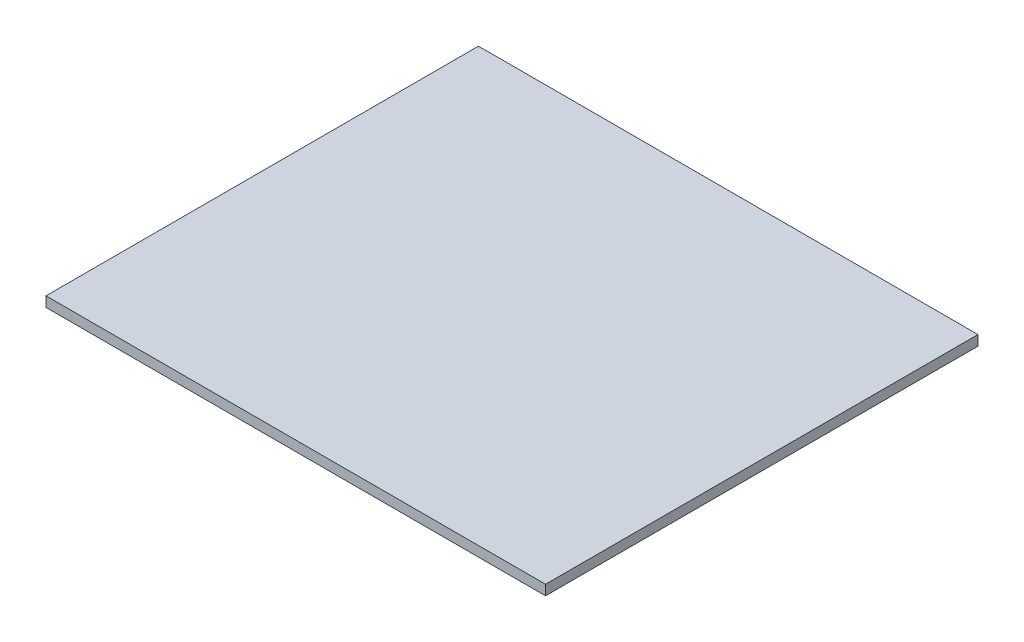
ISO-10303-21;
HEADER;
FILE_DESCRIPTION(('STEP AP214'),'2;1');
FILE_NAME('part.step','',(''),(''),'','','');
FILE_SCHEMA(('AUTOMOTIVE_DESIGN { 1 0 10303 214 1 1 1 1 }'));
ENDSEC;
DATA;
#1=APPLICATION_CONTEXT('core data for automotive mechanical design processes');
#2=APPLICATION_PROTOCOL_DEFINITION('international standard','automotive_design',2000,#1);
#3=PRODUCT_CONTEXT('',#1,'mechanical');
#4=PRODUCT('Part','Part','',(#3));
#5=PRODUCT_RELATED_PRODUCT_CATEGORY('part','',(#4));
#6=PRODUCT_DEFINITION_FORMATION('','',#4);
#7=PRODUCT_DEFINITION_CONTEXT('part definition',#1,'design');
#8=PRODUCT_DEFINITION('design','',#6,#7);
#9=PRODUCT_DEFINITION_SHAPE('','',#8);
#10=(LENGTH_UNIT() NAMED_UNIT(*) SI_UNIT(.MILLI.,.METRE.));
#11=(NAMED_UNIT(*) PLANE_ANGLE_UNIT() SI_UNIT($,.RADIAN.));
#12=(NAMED_UNIT(*) SI_UNIT($,.STERADIAN.) SOLID_ANGLE_UNIT());
#13=UNCERTAINTY_MEASURE_WITH_UNIT(LENGTH_MEASURE(1.E-05),#10,'distance_accuracy_value','');
#14=(GEOMETRIC_REPRESENTATION_CONTEXT(3) GLOBAL_UNCERTAINTY_ASSIGNED_CONTEXT((#13)) GLOBAL_UNIT_ASSIGNED_CONTEXT((#10,
#11,#12)) REPRESENTATION_CONTEXT('',''));
#15=CARTESIAN_POINT('',(0.,0.,0.));
#16=DIRECTION('',(0.,0.,1.));
#17=DIRECTION('',(1.,0.,0.));
#18=AXIS2_PLACEMENT_3D('',#15,#16,#17);
#19=CARTESIAN_POINT('',(74.5,3.,-64.5));
#20=DIRECTION('',(-1.,0.,0.));
#21=DIRECTION('',(0.,0.,1.));
#22=AXIS2_PLACEMENT_3D('',#19,#20,#21);
#23=PLANE('',#22);
#24=DIRECTION('',(0.,0.,-1.));
#25=VECTOR('',#24,1.);
#26=CARTESIAN_POINT('',(74.5,0.,-64.5));
#27=LINE('',#26,#25);
#28=CARTESIAN_POINT('',(74.5,0.,64.5));
#29=VERTEX_POINT('',#28);
#30=CARTESIAN_POINT('',(74.5,0.,-64.5));
#31=VERTEX_POINT('',#30);
#32=EDGE_CURVE('E100',#29,#31,#27,.T.);
#33=ORIENTED_EDGE('',*,*,#32,.T.);
#34=DIRECTION('',(0.,-1.,0.));
#35=VECTOR('',#34,1.);
#36=CARTESIAN_POINT('',(74.5,3.,-64.5));
#37=LINE('',#36,#35);
#38=CARTESIAN_POINT('',(74.5,3.,-64.5));
#39=VERTEX_POINT('',#38);
#40=EDGE_CURVE('E11',#39,#31,#37,.T.);
#41=ORIENTED_EDGE('',*,*,#40,.F.);
#42=DIRECTION('',(0.,0.,-1.));
#43=VECTOR('',#42,1.);
#44=CARTESIAN_POINT('',(74.5,3.,-64.5));
#45=LINE('',#44,#43);
#46=CARTESIAN_POINT('',(74.5,3.,64.5));
#47=VERTEX_POINT('',#46);
#48=EDGE_CURVE('E88',#47,#39,#45,.T.);
#49=ORIENTED_EDGE('',*,*,#48,.F.);
#50=DIRECTION('',(0.,-1.,0.));
#51=VECTOR('',#50,1.);
#52=CARTESIAN_POINT('',(74.5,3.,64.5));
#53=LINE('',#52,#51);
#54=EDGE_CURVE('E96',#47,#29,#53,.T.);
#55=ORIENTED_EDGE('',*,*,#54,.T.);
#56=EDGE_LOOP('',(#33,#41,#49,#55));
#57=FACE_BOUND('',#56,.T.);
#58=ADVANCED_FACE('F37',(#57),#23,.F.);
#59=CARTESIAN_POINT('',(-74.5,3.,-64.5));
#60=DIRECTION('',(0.,0.,1.));
#61=DIRECTION('',(1.,0.,0.));
#62=AXIS2_PLACEMENT_3D('',#59,#60,#61);
#63=PLANE('',#62);
#64=DIRECTION('',(-1.,0.,0.));
#65=VECTOR('',#64,1.);
#66=CARTESIAN_POINT('',(-74.5,0.,-64.5));
#67=LINE('',#66,#65);
#68=CARTESIAN_POINT('',(-74.5,0.,-64.5));
#69=VERTEX_POINT('',#68);
#70=EDGE_CURVE('E92',#31,#69,#67,.T.);
#71=ORIENTED_EDGE('',*,*,#70,.T.);
#72=DIRECTION('',(0.,-1.,0.));
#73=VECTOR('',#72,1.);
#74=CARTESIAN_POINT('',(-74.5,3.,-64.5));
#75=LINE('',#74,#73);
#76=CARTESIAN_POINT('',(-74.5,3.,-64.5));
#77=VERTEX_POINT('',#76);
#78=EDGE_CURVE('E45',#77,#69,#75,.T.);
#79=ORIENTED_EDGE('',*,*,#78,.F.);
#80=DIRECTION('',(-1.,0.,0.));
#81=VECTOR('',#80,1.);
#82=CARTESIAN_POINT('',(-74.5,3.,-64.5));
#83=LINE('',#82,#81);
#84=EDGE_CURVE('E83',#39,#77,#83,.T.);
#85=ORIENTED_EDGE('',*,*,#84,.F.);
#86=ORIENTED_EDGE('',*,*,#40,.T.);
#87=EDGE_LOOP('',(#71,#79,#85,#86));
#88=FACE_BOUND('',#87,.T.);
#89=ADVANCED_FACE('F91',(#88),#63,.F.);
#90=CARTESIAN_POINT('',(-74.5,3.,-64.5));
#91=DIRECTION('',(1.,0.,0.));
#92=DIRECTION('',(0.,0.,-1.));
#93=AXIS2_PLACEMENT_3D('',#90,#91,#92);
#94=PLANE('',#93);
#95=DIRECTION('',(0.,0.,1.));
#96=VECTOR('',#95,1.);
#97=CARTESIAN_POINT('',(-74.5,0.,-64.5));
#98=LINE('',#97,#96);
#99=CARTESIAN_POINT('',(-74.5,0.,64.5));
#100=VERTEX_POINT('',#99);
#101=EDGE_CURVE('E70',#69,#100,#98,.T.);
#102=ORIENTED_EDGE('',*,*,#101,.T.);
#103=DIRECTION('',(0.,-1.,0.));
#104=VECTOR('',#103,1.);
#105=CARTESIAN_POINT('',(-74.5,3.,64.5));
#106=LINE('',#105,#104);
#107=CARTESIAN_POINT('',(-74.5,3.,64.5));
#108=VERTEX_POINT('',#107);
#109=EDGE_CURVE('E93',#108,#100,#106,.T.);
#110=ORIENTED_EDGE('',*,*,#109,.F.);
#111=DIRECTION('',(0.,0.,1.));
#112=VECTOR('',#111,1.);
#113=CARTESIAN_POINT('',(-74.5,3.,-64.5));
#114=LINE('',#113,#112);
#115=EDGE_CURVE('E86',#77,#108,#114,.T.);
#116=ORIENTED_EDGE('',*,*,#115,.F.);
#117=ORIENTED_EDGE('',*,*,#78,.T.);
#118=EDGE_LOOP('',(#102,#110,#116,#117));
#119=FACE_BOUND('',#118,.T.);
#120=ADVANCED_FACE('F94',(#119),#94,.F.);
#121=CARTESIAN_POINT('',(-74.5,3.,64.5));
#122=DIRECTION('',(0.,0.,-1.));
#123=DIRECTION('',(-1.,0.,0.));
#124=AXIS2_PLACEMENT_3D('',#121,#122,#123);
#125=PLANE('',#124);
#126=DIRECTION('',(1.,0.,0.));
#127=VECTOR('',#126,1.);
#128=CARTESIAN_POINT('',(-74.5,0.,64.5));
#129=LINE('',#128,#127);
#130=EDGE_CURVE('E76',#100,#29,#129,.T.);
#131=ORIENTED_EDGE('',*,*,#130,.T.);
#132=ORIENTED_EDGE('',*,*,#54,.F.);
#133=DIRECTION('',(1.,0.,0.));
#134=VECTOR('',#133,1.);
#135=CARTESIAN_POINT('',(-74.5,3.,64.5));
#136=LINE('',#135,#134);
#137=EDGE_CURVE('E53',#108,#47,#136,.T.);
#138=ORIENTED_EDGE('',*,*,#137,.F.);
#139=ORIENTED_EDGE('',*,*,#109,.T.);
#140=EDGE_LOOP('',(#131,#132,#138,#139));
#141=FACE_BOUND('',#140,.T.);
#142=ADVANCED_FACE('F107',(#141),#125,.F.);
#143=CARTESIAN_POINT('',(0.,3.,0.));
#144=DIRECTION('',(0.,1.,0.));
#145=DIRECTION('',(0.,0.,1.));
#146=AXIS2_PLACEMENT_3D('',#143,#144,#145);
#147=PLANE('',#146);
#148=ORIENTED_EDGE('',*,*,#48,.T.);
#149=ORIENTED_EDGE('',*,*,#84,.T.);
#150=ORIENTED_EDGE('',*,*,#115,.T.);
#151=ORIENTED_EDGE('',*,*,#137,.T.);
#152=EDGE_LOOP('',(#148,#149,#150,#151));
#153=FACE_BOUND('',#152,.T.);
#154=ADVANCED_FACE('F84',(#153),#147,.T.);
#155=CARTESIAN_POINT('',(0.,0.,0.));
#156=DIRECTION('',(0.,1.,0.));
#157=DIRECTION('',(0.,0.,1.));
#158=AXIS2_PLACEMENT_3D('',#155,#156,#157);
#159=PLANE('',#158);
#160=ORIENTED_EDGE('',*,*,#32,.F.);
#161=ORIENTED_EDGE('',*,*,#130,.F.);
#162=ORIENTED_EDGE('',*,*,#101,.F.);
#163=ORIENTED_EDGE('',*,*,#70,.F.);
#164=EDGE_LOOP('',(#160,#161,#162,#163));
#165=FACE_BOUND('',#164,.T.);
#166=ADVANCED_FACE('F110',(#165),#159,.F.);
#167=CLOSED_SHELL('',(#58,#89,#120,#142,#154,#166));
#168=MANIFOLD_SOLID_BREP('B2',#167);
#169=ADVANCED_BREP_SHAPE_REPRESENTATION('',(#18,#168),#14);
#170=SHAPE_DEFINITION_REPRESENTATION(#9,#169);
ENDSEC;
END-ISO-10303-21;
